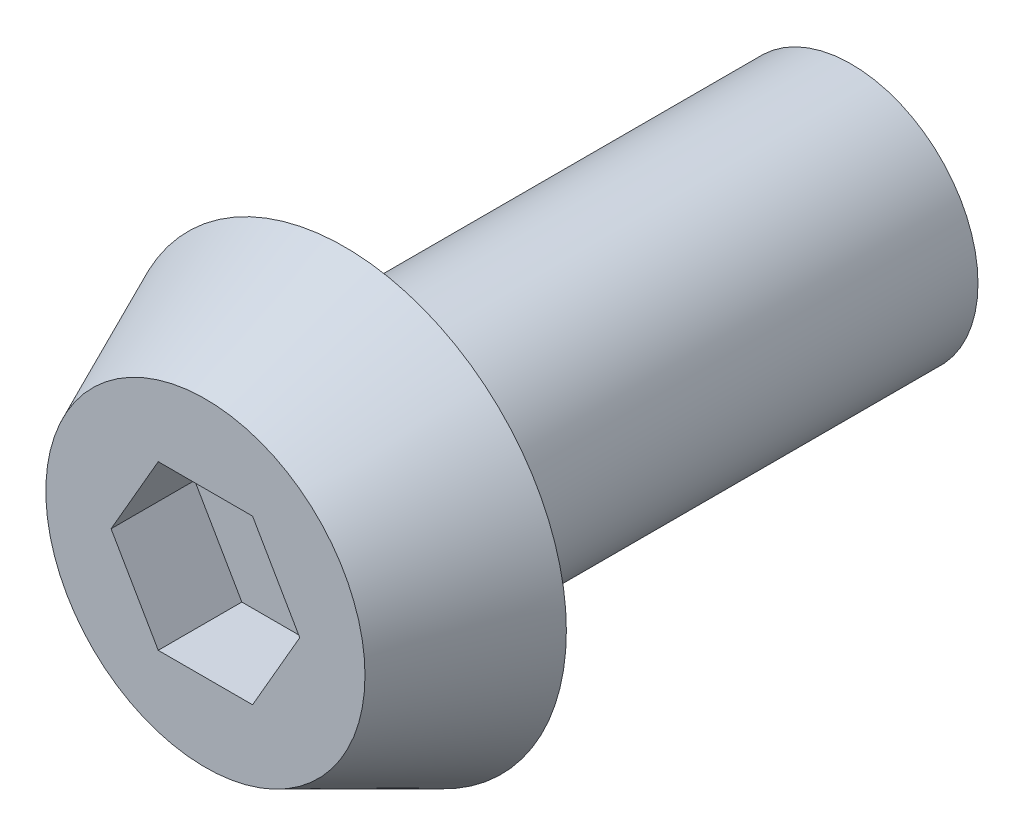
ISO-10303-21;
HEADER;
FILE_DESCRIPTION(('STEP AP214'),'2;1');
FILE_NAME('part.step','',(''),(''),'','','');
FILE_SCHEMA(('AUTOMOTIVE_DESIGN { 1 0 10303 214 1 1 1 1 }'));
ENDSEC;
DATA;
#1=APPLICATION_CONTEXT('core data for automotive mechanical design processes');
#2=APPLICATION_PROTOCOL_DEFINITION('international standard','automotive_design',2000,#1);
#3=PRODUCT_CONTEXT('',#1,'mechanical');
#4=PRODUCT('Part','Part','',(#3));
#5=PRODUCT_RELATED_PRODUCT_CATEGORY('part','',(#4));
#6=PRODUCT_DEFINITION_FORMATION('','',#4);
#7=PRODUCT_DEFINITION_CONTEXT('part definition',#1,'design');
#8=PRODUCT_DEFINITION('design','',#6,#7);
#9=PRODUCT_DEFINITION_SHAPE('','',#8);
#10=(LENGTH_UNIT() NAMED_UNIT(*) SI_UNIT(.MILLI.,.METRE.));
#11=(NAMED_UNIT(*) PLANE_ANGLE_UNIT() SI_UNIT($,.RADIAN.));
#12=(NAMED_UNIT(*) SI_UNIT($,.STERADIAN.) SOLID_ANGLE_UNIT());
#13=UNCERTAINTY_MEASURE_WITH_UNIT(LENGTH_MEASURE(1.E-05),#10,'distance_accuracy_value','');
#14=(GEOMETRIC_REPRESENTATION_CONTEXT(3) GLOBAL_UNCERTAINTY_ASSIGNED_CONTEXT((#13)) GLOBAL_UNIT_ASSIGNED_CONTEXT((#10,
#11,#12)) REPRESENTATION_CONTEXT('',''));
#15=CARTESIAN_POINT('',(0.,0.,0.));
#16=DIRECTION('',(0.,0.,1.));
#17=DIRECTION('',(1.,0.,0.));
#18=AXIS2_PLACEMENT_3D('',#15,#16,#17);
#19=CARTESIAN_POINT('',(0.,0.,1.1));
#20=DIRECTION('',(0.,0.,1.));
#21=DIRECTION('',(1.,0.,0.));
#22=AXIS2_PLACEMENT_3D('',#19,#20,#21);
#23=PLANE('',#22);
#24=CARTESIAN_POINT('',(0.,0.,1.1));
#25=DIRECTION('',(0.,0.,1.));
#26=DIRECTION('',(1.,0.,0.));
#27=AXIS2_PLACEMENT_3D('',#24,#25,#26);
#28=CIRCLE('',#27,1.26);
#29=CARTESIAN_POINT('',(1.26,0.,1.1));
#30=VERTEX_POINT('',#29);
#31=EDGE_CURVE('E131',#30,#30,#28,.T.);
#32=ORIENTED_EDGE('',*,*,#31,.T.);
#33=EDGE_LOOP('',(#32));
#34=FACE_BOUND('',#33,.T.);
#35=DIRECTION('',(1.,0.,0.));
#36=VECTOR('',#35,1.);
#37=CARTESIAN_POINT('',(0.,0.645,1.1));
#38=LINE('',#37,#36);
#39=CARTESIAN_POINT('',(-0.372390923627308,0.645,1.1));
#40=VERTEX_POINT('',#39);
#41=CARTESIAN_POINT('',(0.372390923627309,0.645,1.1));
#42=VERTEX_POINT('',#41);
#43=EDGE_CURVE('E47',#40,#42,#38,.T.);
#44=ORIENTED_EDGE('',*,*,#43,.T.);
#45=DIRECTION('',(0.5,-0.866025403784439,0.));
#46=VECTOR('',#45,1.);
#47=CARTESIAN_POINT('',(0.558586385440963,0.3225,1.1));
#48=LINE('',#47,#46);
#49=CARTESIAN_POINT('',(0.744781847254617,0.,1.1));
#50=VERTEX_POINT('',#49);
#51=EDGE_CURVE('E11',#42,#50,#48,.T.);
#52=ORIENTED_EDGE('',*,*,#51,.T.);
#53=DIRECTION('',(-0.5,-0.866025403784439,0.));
#54=VECTOR('',#53,1.);
#55=CARTESIAN_POINT('',(0.558586385440963,-0.3225,1.1));
#56=LINE('',#55,#54);
#57=CARTESIAN_POINT('',(0.372390923627309,-0.645,1.1));
#58=VERTEX_POINT('',#57);
#59=EDGE_CURVE('E138',#50,#58,#56,.T.);
#60=ORIENTED_EDGE('',*,*,#59,.T.);
#61=DIRECTION('',(-1.,0.,0.));
#62=VECTOR('',#61,1.);
#63=CARTESIAN_POINT('',(0.,-0.645,1.1));
#64=LINE('',#63,#62);
#65=CARTESIAN_POINT('',(-0.372390923627309,-0.645,1.1));
#66=VERTEX_POINT('',#65);
#67=EDGE_CURVE('E143',#58,#66,#64,.T.);
#68=ORIENTED_EDGE('',*,*,#67,.T.);
#69=DIRECTION('',(-0.5,0.866025403784439,0.));
#70=VECTOR('',#69,1.);
#71=CARTESIAN_POINT('',(-0.558586385440963,-0.3225,1.1));
#72=LINE('',#71,#70);
#73=CARTESIAN_POINT('',(-0.744781847254617,0.,1.1));
#74=VERTEX_POINT('',#73);
#75=EDGE_CURVE('E146',#66,#74,#72,.T.);
#76=ORIENTED_EDGE('',*,*,#75,.T.);
#77=DIRECTION('',(0.5,0.866025403784439,0.));
#78=VECTOR('',#77,1.);
#79=CARTESIAN_POINT('',(-0.558586385440963,0.3225,1.1));
#80=LINE('',#79,#78);
#81=EDGE_CURVE('E149',#74,#40,#80,.T.);
#82=ORIENTED_EDGE('',*,*,#81,.T.);
#83=EDGE_LOOP('',(#44,#52,#60,#68,#76,#82));
#84=FACE_BOUND('',#83,.T.);
#85=ADVANCED_FACE('F39',(#34,#84),#23,.T.);
#86=CARTESIAN_POINT('',(0.,0.,-4.));
#87=DIRECTION('',(0.,0.,1.));
#88=DIRECTION('',(1.,0.,0.));
#89=AXIS2_PLACEMENT_3D('',#86,#87,#88);
#90=CYLINDRICAL_SURFACE('',#89,1.);
#91=CARTESIAN_POINT('',(0.,0.,-4.));
#92=DIRECTION('',(0.,0.,1.));
#93=DIRECTION('',(1.,0.,0.));
#94=AXIS2_PLACEMENT_3D('',#91,#92,#93);
#95=CIRCLE('',#94,1.);
#96=CARTESIAN_POINT('',(1.,0.,-4.));
#97=VERTEX_POINT('',#96);
#98=EDGE_CURVE('E135',#97,#97,#95,.T.);
#99=ORIENTED_EDGE('',*,*,#98,.T.);
#100=EDGE_LOOP('',(#99));
#101=FACE_BOUND('',#100,.T.);
#102=CARTESIAN_POINT('',(0.,0.,0.));
#103=DIRECTION('',(0.,0.,1.));
#104=DIRECTION('',(1.,0.,0.));
#105=AXIS2_PLACEMENT_3D('',#102,#103,#104);
#106=CIRCLE('',#105,1.);
#107=CARTESIAN_POINT('',(1.,0.,0.));
#108=VERTEX_POINT('',#107);
#109=EDGE_CURVE('E134',#108,#108,#106,.T.);
#110=ORIENTED_EDGE('',*,*,#109,.F.);
#111=EDGE_LOOP('',(#110));
#112=FACE_BOUND('',#111,.T.);
#113=ADVANCED_FACE('F41',(#101,#112),#90,.T.);
#114=CARTESIAN_POINT('',(0.,0.,-4.));
#115=DIRECTION('',(0.,0.,1.));
#116=DIRECTION('',(1.,0.,0.));
#117=AXIS2_PLACEMENT_3D('',#114,#115,#116);
#118=PLANE('',#117);
#119=ORIENTED_EDGE('',*,*,#98,.F.);
#120=EDGE_LOOP('',(#119));
#121=FACE_BOUND('',#120,.T.);
#122=ADVANCED_FACE('F177',(#121),#118,.F.);
#123=CARTESIAN_POINT('',(0.,0.,0.));
#124=DIRECTION('',(0.,0.,-1.));
#125=DIRECTION('',(1.,0.,0.));
#126=AXIS2_PLACEMENT_3D('',#123,#124,#125);
#127=CONICAL_SURFACE('',#126,1.75,0.41906749969982);
#128=ORIENTED_EDGE('',*,*,#31,.F.);
#129=EDGE_LOOP('',(#128));
#130=FACE_BOUND('',#129,.T.);
#131=CARTESIAN_POINT('',(0.,0.,0.));
#132=DIRECTION('',(0.,0.,1.));
#133=DIRECTION('',(1.,0.,0.));
#134=AXIS2_PLACEMENT_3D('',#131,#132,#133);
#135=CIRCLE('',#134,1.75);
#136=CARTESIAN_POINT('',(1.75,0.,0.));
#137=VERTEX_POINT('',#136);
#138=EDGE_CURVE('E96',#137,#137,#135,.T.);
#139=ORIENTED_EDGE('',*,*,#138,.T.);
#140=EDGE_LOOP('',(#139));
#141=FACE_BOUND('',#140,.T.);
#142=ADVANCED_FACE('F185',(#130,#141),#127,.T.);
#143=CARTESIAN_POINT('',(0.,0.,0.));
#144=DIRECTION('',(0.,0.,1.));
#145=DIRECTION('',(1.,0.,0.));
#146=AXIS2_PLACEMENT_3D('',#143,#144,#145);
#147=PLANE('',#146);
#148=ORIENTED_EDGE('',*,*,#109,.T.);
#149=EDGE_LOOP('',(#148));
#150=FACE_BOUND('',#149,.T.);
#151=ORIENTED_EDGE('',*,*,#138,.F.);
#152=EDGE_LOOP('',(#151));
#153=FACE_BOUND('',#152,.T.);
#154=ADVANCED_FACE('F182',(#150,#153),#147,.F.);
#155=CARTESIAN_POINT('',(0.372390923627309,0.645,1.6));
#156=DIRECTION('',(-0.866025403784439,-0.5,0.));
#157=DIRECTION('',(0.5,-0.866025403784439,0.));
#158=AXIS2_PLACEMENT_3D('',#155,#156,#157);
#159=PLANE('',#158);
#160=DIRECTION('',(0.,0.,-1.));
#161=VECTOR('',#160,1.);
#162=CARTESIAN_POINT('',(0.372390923627309,0.645,1.6));
#163=LINE('',#162,#161);
#164=CARTESIAN_POINT('',(0.372390923627309,0.645,0.44));
#165=VERTEX_POINT('',#164);
#166=EDGE_CURVE('E89',#42,#165,#163,.T.);
#167=ORIENTED_EDGE('',*,*,#166,.T.);
#168=DIRECTION('',(-0.5,0.866025403784439,0.));
#169=VECTOR('',#168,1.);
#170=CARTESIAN_POINT('',(0.372390923627309,0.645,0.44));
#171=LINE('',#170,#169);
#172=CARTESIAN_POINT('',(0.744781847254617,0.,0.44));
#173=VERTEX_POINT('',#172);
#174=EDGE_CURVE('E93',#173,#165,#171,.T.);
#175=ORIENTED_EDGE('',*,*,#174,.F.);
#176=DIRECTION('',(0.,0.,-1.));
#177=VECTOR('',#176,1.);
#178=CARTESIAN_POINT('',(0.744781847254617,0.,1.6));
#179=LINE('',#178,#177);
#180=EDGE_CURVE('E121',#50,#173,#179,.T.);
#181=ORIENTED_EDGE('',*,*,#180,.F.);
#182=ORIENTED_EDGE('',*,*,#51,.F.);
#183=EDGE_LOOP('',(#167,#175,#181,#182));
#184=FACE_BOUND('',#183,.T.);
#185=ADVANCED_FACE('F91',(#184),#159,.T.);
#186=CARTESIAN_POINT('',(-0.372390923627308,0.645,1.6));
#187=DIRECTION('',(0.,-1.,0.));
#188=DIRECTION('',(0.,0.,-1.));
#189=AXIS2_PLACEMENT_3D('',#186,#187,#188);
#190=PLANE('',#189);
#191=DIRECTION('',(0.,0.,-1.));
#192=VECTOR('',#191,1.);
#193=CARTESIAN_POINT('',(-0.372390923627308,0.645,1.6));
#194=LINE('',#193,#192);
#195=CARTESIAN_POINT('',(-0.372390923627308,0.645,0.44));
#196=VERTEX_POINT('',#195);
#197=EDGE_CURVE('E97',#40,#196,#194,.T.);
#198=ORIENTED_EDGE('',*,*,#197,.T.);
#199=DIRECTION('',(-1.,0.,0.));
#200=VECTOR('',#199,1.);
#201=CARTESIAN_POINT('',(-0.372390923627308,0.645,0.44));
#202=LINE('',#201,#200);
#203=EDGE_CURVE('E100',#165,#196,#202,.T.);
#204=ORIENTED_EDGE('',*,*,#203,.F.);
#205=ORIENTED_EDGE('',*,*,#166,.F.);
#206=ORIENTED_EDGE('',*,*,#43,.F.);
#207=EDGE_LOOP('',(#198,#204,#205,#206));
#208=FACE_BOUND('',#207,.T.);
#209=ADVANCED_FACE('F101',(#208),#190,.T.);
#210=CARTESIAN_POINT('',(-0.744781847254617,0.,1.6));
#211=DIRECTION('',(0.866025403784439,-0.5,0.));
#212=DIRECTION('',(0.5,0.866025403784439,0.));
#213=AXIS2_PLACEMENT_3D('',#210,#211,#212);
#214=PLANE('',#213);
#215=DIRECTION('',(0.,0.,-1.));
#216=VECTOR('',#215,1.);
#217=CARTESIAN_POINT('',(-0.744781847254617,0.,1.6));
#218=LINE('',#217,#216);
#219=CARTESIAN_POINT('',(-0.744781847254617,0.,0.44));
#220=VERTEX_POINT('',#219);
#221=EDGE_CURVE('E126',#74,#220,#218,.T.);
#222=ORIENTED_EDGE('',*,*,#221,.T.);
#223=DIRECTION('',(-0.5,-0.866025403784438,0.));
#224=VECTOR('',#223,1.);
#225=CARTESIAN_POINT('',(-0.744781847254617,0.,0.44));
#226=LINE('',#225,#224);
#227=EDGE_CURVE('E106',#196,#220,#226,.T.);
#228=ORIENTED_EDGE('',*,*,#227,.F.);
#229=ORIENTED_EDGE('',*,*,#197,.F.);
#230=ORIENTED_EDGE('',*,*,#81,.F.);
#231=EDGE_LOOP('',(#222,#228,#229,#230));
#232=FACE_BOUND('',#231,.T.);
#233=ADVANCED_FACE('F153',(#232),#214,.T.);
#234=CARTESIAN_POINT('',(-0.372390923627309,-0.645,1.6));
#235=DIRECTION('',(0.866025403784439,0.5,0.));
#236=DIRECTION('',(-0.5,0.866025403784439,0.));
#237=AXIS2_PLACEMENT_3D('',#234,#235,#236);
#238=PLANE('',#237);
#239=DIRECTION('',(0.,0.,-1.));
#240=VECTOR('',#239,1.);
#241=CARTESIAN_POINT('',(-0.372390923627309,-0.645,1.6));
#242=LINE('',#241,#240);
#243=CARTESIAN_POINT('',(-0.372390923627309,-0.645,0.44));
#244=VERTEX_POINT('',#243);
#245=EDGE_CURVE('E124',#66,#244,#242,.T.);
#246=ORIENTED_EDGE('',*,*,#245,.T.);
#247=DIRECTION('',(0.5,-0.866025403784439,0.));
#248=VECTOR('',#247,1.);
#249=CARTESIAN_POINT('',(-0.372390923627309,-0.645,0.44));
#250=LINE('',#249,#248);
#251=EDGE_CURVE('E115',#220,#244,#250,.T.);
#252=ORIENTED_EDGE('',*,*,#251,.F.);
#253=ORIENTED_EDGE('',*,*,#221,.F.);
#254=ORIENTED_EDGE('',*,*,#75,.F.);
#255=EDGE_LOOP('',(#246,#252,#253,#254));
#256=FACE_BOUND('',#255,.T.);
#257=ADVANCED_FACE('F158',(#256),#238,.T.);
#258=CARTESIAN_POINT('',(0.372390923627309,-0.645,1.6));
#259=DIRECTION('',(0.,1.,0.));
#260=DIRECTION('',(-1.,0.,0.));
#261=AXIS2_PLACEMENT_3D('',#258,#259,#260);
#262=PLANE('',#261);
#263=DIRECTION('',(0.,0.,-1.));
#264=VECTOR('',#263,1.);
#265=CARTESIAN_POINT('',(0.372390923627309,-0.645,1.6));
#266=LINE('',#265,#264);
#267=CARTESIAN_POINT('',(0.372390923627309,-0.645,0.44));
#268=VERTEX_POINT('',#267);
#269=EDGE_CURVE('E54',#58,#268,#266,.T.);
#270=ORIENTED_EDGE('',*,*,#269,.T.);
#271=DIRECTION('',(1.,0.,0.));
#272=VECTOR('',#271,1.);
#273=CARTESIAN_POINT('',(0.372390923627309,-0.645,0.44));
#274=LINE('',#273,#272);
#275=EDGE_CURVE('E118',#244,#268,#274,.T.);
#276=ORIENTED_EDGE('',*,*,#275,.F.);
#277=ORIENTED_EDGE('',*,*,#245,.F.);
#278=ORIENTED_EDGE('',*,*,#67,.F.);
#279=EDGE_LOOP('',(#270,#276,#277,#278));
#280=FACE_BOUND('',#279,.T.);
#281=ADVANCED_FACE('F161',(#280),#262,.T.);
#282=CARTESIAN_POINT('',(0.744781847254617,0.,1.6));
#283=DIRECTION('',(-0.866025403784439,0.5,0.));
#284=DIRECTION('',(-0.5,-0.866025403784439,0.));
#285=AXIS2_PLACEMENT_3D('',#282,#283,#284);
#286=PLANE('',#285);
#287=ORIENTED_EDGE('',*,*,#180,.T.);
#288=DIRECTION('',(0.5,0.866025403784439,0.));
#289=VECTOR('',#288,1.);
#290=CARTESIAN_POINT('',(0.744781847254617,0.,0.44));
#291=LINE('',#290,#289);
#292=EDGE_CURVE('E111',#268,#173,#291,.T.);
#293=ORIENTED_EDGE('',*,*,#292,.F.);
#294=ORIENTED_EDGE('',*,*,#269,.F.);
#295=ORIENTED_EDGE('',*,*,#59,.F.);
#296=EDGE_LOOP('',(#287,#293,#294,#295));
#297=FACE_BOUND('',#296,.T.);
#298=ADVANCED_FACE('F162',(#297),#286,.T.);
#299=CARTESIAN_POINT('',(0.,0.,0.44));
#300=DIRECTION('',(0.,0.,-1.));
#301=DIRECTION('',(-1.,0.,0.));
#302=AXIS2_PLACEMENT_3D('',#299,#300,#301);
#303=PLANE('',#302);
#304=ORIENTED_EDGE('',*,*,#174,.T.);
#305=ORIENTED_EDGE('',*,*,#203,.T.);
#306=ORIENTED_EDGE('',*,*,#227,.T.);
#307=ORIENTED_EDGE('',*,*,#251,.T.);
#308=ORIENTED_EDGE('',*,*,#275,.T.);
#309=ORIENTED_EDGE('',*,*,#292,.T.);
#310=EDGE_LOOP('',(#304,#305,#306,#307,#308,#309));
#311=FACE_BOUND('',#310,.T.);
#312=ADVANCED_FACE('F109',(#311),#303,.F.);
#313=CLOSED_SHELL('',(#85,#113,#122,#142,#154,#185,#209,#233,#257,#281,#298,#312));
#314=MANIFOLD_SOLID_BREP('B2',#313);
#315=ADVANCED_BREP_SHAPE_REPRESENTATION('',(#18,#314),#14);
#316=SHAPE_DEFINITION_REPRESENTATION(#9,#315);
ENDSEC;
END-ISO-10303-21;
